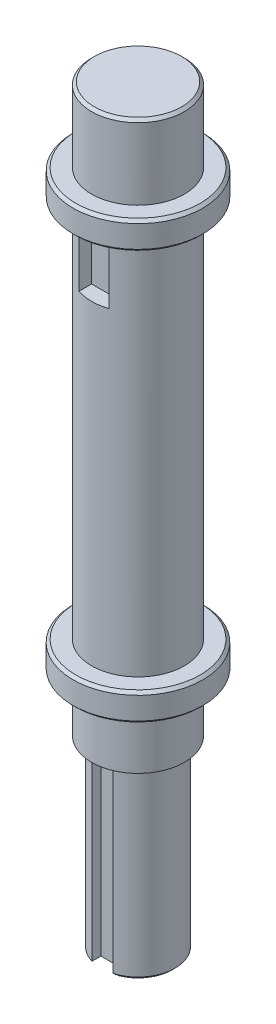
ISO-10303-21;
HEADER;
FILE_DESCRIPTION(('STEP AP214'),'2;1');
FILE_NAME('part.step','',(''),(''),'','','');
FILE_SCHEMA(('AUTOMOTIVE_DESIGN { 1 0 10303 214 1 1 1 1 }'));
ENDSEC;
DATA;
#1=APPLICATION_CONTEXT('core data for automotive mechanical design processes');
#2=APPLICATION_PROTOCOL_DEFINITION('international standard','automotive_design',2000,#1);
#3=PRODUCT_CONTEXT('',#1,'mechanical');
#4=PRODUCT('Part','Part','',(#3));
#5=PRODUCT_RELATED_PRODUCT_CATEGORY('part','',(#4));
#6=PRODUCT_DEFINITION_FORMATION('','',#4);
#7=PRODUCT_DEFINITION_CONTEXT('part definition',#1,'design');
#8=PRODUCT_DEFINITION('design','',#6,#7);
#9=PRODUCT_DEFINITION_SHAPE('','',#8);
#10=(LENGTH_UNIT() NAMED_UNIT(*) SI_UNIT(.MILLI.,.METRE.));
#11=(NAMED_UNIT(*) PLANE_ANGLE_UNIT() SI_UNIT($,.RADIAN.));
#12=(NAMED_UNIT(*) SI_UNIT($,.STERADIAN.) SOLID_ANGLE_UNIT());
#13=UNCERTAINTY_MEASURE_WITH_UNIT(LENGTH_MEASURE(1.E-05),#10,'distance_accuracy_value','');
#14=(GEOMETRIC_REPRESENTATION_CONTEXT(3) GLOBAL_UNCERTAINTY_ASSIGNED_CONTEXT((#13)) GLOBAL_UNIT_ASSIGNED_CONTEXT((#10,
#11,#12)) REPRESENTATION_CONTEXT('',''));
#15=CARTESIAN_POINT('',(0.,0.,0.));
#16=DIRECTION('',(0.,0.,1.));
#17=DIRECTION('',(1.,0.,0.));
#18=AXIS2_PLACEMENT_3D('',#15,#16,#17);
#19=CARTESIAN_POINT('',(0.,81.,0.));
#20=DIRECTION('',(0.,1.,0.));
#21=DIRECTION('',(-1.,0.,0.));
#22=AXIS2_PLACEMENT_3D('',#19,#20,#21);
#23=CYLINDRICAL_SURFACE('',#22,5.);
#24=DIRECTION('',(0.,1.,0.));
#25=VECTOR('',#24,1.);
#26=CARTESIAN_POINT('',(1.62499999999999,81.,4.72857007984444));
#27=LINE('',#26,#25);
#28=CARTESIAN_POINT('',(1.62499999999999,63.,4.72857007984444));
#29=VERTEX_POINT('',#28);
#30=CARTESIAN_POINT('',(1.62499999999999,70.,4.72857007984444));
#31=VERTEX_POINT('',#30);
#32=EDGE_CURVE('E168',#29,#31,#27,.T.);
#33=ORIENTED_EDGE('',*,*,#32,.F.);
#34=CARTESIAN_POINT('',(0.,63.,0.));
#35=DIRECTION('',(0.,-1.,0.));
#36=DIRECTION('',(0.,0.,-1.));
#37=AXIS2_PLACEMENT_3D('',#34,#35,#36);
#38=CIRCLE('',#37,5.);
#39=CARTESIAN_POINT('',(-1.625,63.,4.72857007984444));
#40=VERTEX_POINT('',#39);
#41=EDGE_CURVE('E177',#29,#40,#38,.T.);
#42=ORIENTED_EDGE('',*,*,#41,.T.);
#43=DIRECTION('',(0.,1.,0.));
#44=VECTOR('',#43,1.);
#45=CARTESIAN_POINT('',(-1.625,81.,4.72857007984444));
#46=LINE('',#45,#44);
#47=CARTESIAN_POINT('',(-1.625,70.,4.72857007984444));
#48=VERTEX_POINT('',#47);
#49=EDGE_CURVE('E166',#48,#40,#46,.F.);
#50=ORIENTED_EDGE('',*,*,#49,.F.);
#51=CARTESIAN_POINT('',(0.,70.,0.));
#52=DIRECTION('',(0.,1.,0.));
#53=DIRECTION('',(-1.,0.,0.));
#54=AXIS2_PLACEMENT_3D('',#51,#52,#53);
#55=CIRCLE('',#54,5.);
#56=EDGE_CURVE('E174',#31,#48,#55,.T.);
#57=ORIENTED_EDGE('',*,*,#56,.F.);
#58=EDGE_LOOP('',(#33,#42,#50,#57));
#59=FACE_BOUND('',#58,.T.);
#60=CARTESIAN_POINT('',(0.,29.,0.));
#61=DIRECTION('',(0.,-1.,0.));
#62=DIRECTION('',(1.,0.,0.));
#63=AXIS2_PLACEMENT_3D('',#60,#61,#62);
#64=CIRCLE('',#63,5.);
#65=CARTESIAN_POINT('',(5.,29.,0.));
#66=VERTEX_POINT('',#65);
#67=EDGE_CURVE('E214',#66,#66,#64,.T.);
#68=ORIENTED_EDGE('',*,*,#67,.F.);
#69=EDGE_LOOP('',(#68));
#70=FACE_BOUND('',#69,.T.);
#71=ADVANCED_FACE('F33',(#59,#70),#23,.T.);
#72=CARTESIAN_POINT('',(5.,70.,0.));
#73=DIRECTION('',(0.,1.,0.));
#74=DIRECTION('',(-1.,0.,0.));
#75=AXIS2_PLACEMENT_3D('',#72,#73,#74);
#76=PLANE('',#75);
#77=CARTESIAN_POINT('',(0.,70.,0.));
#78=DIRECTION('',(0.,1.,0.));
#79=DIRECTION('',(-1.,0.,0.));
#80=AXIS2_PLACEMENT_3D('',#77,#78,#79);
#81=CIRCLE('',#80,6.69999999999999);
#82=CARTESIAN_POINT('',(-6.69999999999999,70.,0.));
#83=VERTEX_POINT('',#82);
#84=EDGE_CURVE('E208',#83,#83,#81,.F.);
#85=ORIENTED_EDGE('',*,*,#84,.T.);
#86=EDGE_LOOP('',(#85));
#87=FACE_BOUND('',#86,.T.);
#88=ORIENTED_EDGE('',*,*,#56,.T.);
#89=DIRECTION('',(0.,0.,-1.));
#90=VECTOR('',#89,1.);
#91=CARTESIAN_POINT('',(-1.62500000000001,70.,6.625));
#92=LINE('',#91,#90);
#93=CARTESIAN_POINT('',(-1.625,70.,3.375));
#94=VERTEX_POINT('',#93);
#95=EDGE_CURVE('E158',#48,#94,#92,.T.);
#96=ORIENTED_EDGE('',*,*,#95,.T.);
#97=DIRECTION('',(1.,0.,0.));
#98=VECTOR('',#97,1.);
#99=CARTESIAN_POINT('',(-1.625,70.,3.375));
#100=LINE('',#99,#98);
#101=CARTESIAN_POINT('',(1.625,70.,3.375));
#102=VERTEX_POINT('',#101);
#103=EDGE_CURVE('E151',#94,#102,#100,.T.);
#104=ORIENTED_EDGE('',*,*,#103,.T.);
#105=DIRECTION('',(0.,0.,1.));
#106=VECTOR('',#105,1.);
#107=CARTESIAN_POINT('',(1.62499999999999,70.,6.625));
#108=LINE('',#107,#106);
#109=EDGE_CURVE('E156',#102,#31,#108,.T.);
#110=ORIENTED_EDGE('',*,*,#109,.T.);
#111=EDGE_LOOP('',(#88,#96,#104,#110));
#112=FACE_BOUND('',#111,.T.);
#113=ADVANCED_FACE('F293',(#87,#112),#76,.F.);
#114=CARTESIAN_POINT('',(0.,81.,0.));
#115=DIRECTION('',(0.,1.,0.));
#116=DIRECTION('',(-1.,0.,0.));
#117=AXIS2_PLACEMENT_3D('',#114,#115,#116);
#118=CYLINDRICAL_SURFACE('',#117,7.00000000000001);
#119=CARTESIAN_POINT('',(0.,70.3,0.));
#120=DIRECTION('',(0.,1.,0.));
#121=DIRECTION('',(-1.,0.,0.));
#122=AXIS2_PLACEMENT_3D('',#119,#120,#121);
#123=CIRCLE('',#122,7.00000000000001);
#124=CARTESIAN_POINT('',(-7.00000000000001,70.3,0.));
#125=VERTEX_POINT('',#124);
#126=EDGE_CURVE('E205',#125,#125,#123,.T.);
#127=ORIENTED_EDGE('',*,*,#126,.T.);
#128=EDGE_LOOP('',(#127));
#129=FACE_BOUND('',#128,.T.);
#130=CARTESIAN_POINT('',(0.,72.7,0.));
#131=DIRECTION('',(0.,-1.,0.));
#132=DIRECTION('',(1.,0.,0.));
#133=AXIS2_PLACEMENT_3D('',#130,#131,#132);
#134=CIRCLE('',#133,7.00000000000001);
#135=CARTESIAN_POINT('',(7.,72.7,0.));
#136=VERTEX_POINT('',#135);
#137=EDGE_CURVE('E202',#136,#136,#134,.T.);
#138=ORIENTED_EDGE('',*,*,#137,.T.);
#139=EDGE_LOOP('',(#138));
#140=FACE_BOUND('',#139,.T.);
#141=ADVANCED_FACE('F298',(#129,#140),#118,.T.);
#142=CARTESIAN_POINT('',(7.,73.,0.));
#143=DIRECTION('',(0.,-1.,0.));
#144=DIRECTION('',(1.,0.,0.));
#145=AXIS2_PLACEMENT_3D('',#142,#143,#144);
#146=PLANE('',#145);
#147=CARTESIAN_POINT('',(0.,73.,0.));
#148=DIRECTION('',(0.,-1.,0.));
#149=DIRECTION('',(1.,0.,0.));
#150=AXIS2_PLACEMENT_3D('',#147,#148,#149);
#151=CIRCLE('',#150,6.7);
#152=CARTESIAN_POINT('',(6.69999999999999,73.,0.));
#153=VERTEX_POINT('',#152);
#154=EDGE_CURVE('E211',#153,#153,#151,.F.);
#155=ORIENTED_EDGE('',*,*,#154,.T.);
#156=EDGE_LOOP('',(#155));
#157=FACE_BOUND('',#156,.T.);
#158=CARTESIAN_POINT('',(0.,73.,0.));
#159=DIRECTION('',(0.,1.,0.));
#160=DIRECTION('',(-1.,0.,0.));
#161=AXIS2_PLACEMENT_3D('',#158,#159,#160);
#162=CIRCLE('',#161,5.);
#163=CARTESIAN_POINT('',(-5.00000000000001,73.,0.));
#164=VERTEX_POINT('',#163);
#165=EDGE_CURVE('E171',#164,#164,#162,.T.);
#166=ORIENTED_EDGE('',*,*,#165,.F.);
#167=EDGE_LOOP('',(#166));
#168=FACE_BOUND('',#167,.T.);
#169=ADVANCED_FACE('F354',(#157,#168),#146,.F.);
#170=CARTESIAN_POINT('',(0.,81.,0.));
#171=DIRECTION('',(0.,1.,0.));
#172=DIRECTION('',(-1.,0.,0.));
#173=AXIS2_PLACEMENT_3D('',#170,#171,#172);
#174=CYLINDRICAL_SURFACE('',#173,5.);
#175=CARTESIAN_POINT('',(0.,80.7,0.));
#176=DIRECTION('',(0.,-1.,0.));
#177=DIRECTION('',(1.,0.,0.));
#178=AXIS2_PLACEMENT_3D('',#175,#176,#177);
#179=CIRCLE('',#178,5.);
#180=CARTESIAN_POINT('',(5.,80.7,0.));
#181=VERTEX_POINT('',#180);
#182=EDGE_CURVE('E199',#181,#181,#179,.T.);
#183=ORIENTED_EDGE('',*,*,#182,.T.);
#184=EDGE_LOOP('',(#183));
#185=FACE_BOUND('',#184,.T.);
#186=ORIENTED_EDGE('',*,*,#165,.T.);
#187=EDGE_LOOP('',(#186));
#188=FACE_BOUND('',#187,.T.);
#189=ADVANCED_FACE('F350',(#185,#188),#174,.T.);
#190=CARTESIAN_POINT('',(5.,81.,0.));
#191=DIRECTION('',(0.,-1.,0.));
#192=DIRECTION('',(1.,0.,0.));
#193=AXIS2_PLACEMENT_3D('',#190,#191,#192);
#194=PLANE('',#193);
#195=CARTESIAN_POINT('',(0.,81.,0.));
#196=DIRECTION('',(0.,-1.,0.));
#197=DIRECTION('',(1.,0.,0.));
#198=AXIS2_PLACEMENT_3D('',#195,#196,#197);
#199=CIRCLE('',#198,4.7);
#200=CARTESIAN_POINT('',(4.69999999999999,81.,0.));
#201=VERTEX_POINT('',#200);
#202=EDGE_CURVE('E196',#201,#201,#199,.F.);
#203=ORIENTED_EDGE('',*,*,#202,.T.);
#204=EDGE_LOOP('',(#203));
#205=FACE_BOUND('',#204,.T.);
#206=ADVANCED_FACE('F335',(#205),#194,.F.);
#207=CARTESIAN_POINT('',(0.,63.,0.));
#208=DIRECTION('',(0.,-1.,0.));
#209=DIRECTION('',(0.,0.,-1.));
#210=AXIS2_PLACEMENT_3D('',#207,#208,#209);
#211=PLANE('',#210);
#212=DIRECTION('',(0.,0.,1.));
#213=VECTOR('',#212,1.);
#214=CARTESIAN_POINT('',(1.62499999999999,63.,6.625));
#215=LINE('',#214,#213);
#216=CARTESIAN_POINT('',(1.625,63.,3.375));
#217=VERTEX_POINT('',#216);
#218=EDGE_CURVE('E147',#217,#29,#215,.T.);
#219=ORIENTED_EDGE('',*,*,#218,.F.);
#220=DIRECTION('',(1.,0.,0.));
#221=VECTOR('',#220,1.);
#222=CARTESIAN_POINT('',(-1.625,63.,3.375));
#223=LINE('',#222,#221);
#224=CARTESIAN_POINT('',(-1.625,63.,3.375));
#225=VERTEX_POINT('',#224);
#226=EDGE_CURVE('E153',#225,#217,#223,.T.);
#227=ORIENTED_EDGE('',*,*,#226,.F.);
#228=DIRECTION('',(0.,0.,-1.));
#229=VECTOR('',#228,1.);
#230=CARTESIAN_POINT('',(-1.62500000000001,63.,6.625));
#231=LINE('',#230,#229);
#232=EDGE_CURVE('E150',#40,#225,#231,.T.);
#233=ORIENTED_EDGE('',*,*,#232,.F.);
#234=ORIENTED_EDGE('',*,*,#41,.F.);
#235=EDGE_LOOP('',(#219,#227,#233,#234));
#236=FACE_BOUND('',#235,.T.);
#237=ADVANCED_FACE('F331',(#236),#211,.F.);
#238=CARTESIAN_POINT('',(1.62499999999999,63.,6.625));
#239=DIRECTION('',(-1.,0.,0.));
#240=DIRECTION('',(0.,0.,1.));
#241=AXIS2_PLACEMENT_3D('',#238,#239,#240);
#242=PLANE('',#241);
#243=ORIENTED_EDGE('',*,*,#32,.T.);
#244=ORIENTED_EDGE('',*,*,#109,.F.);
#245=DIRECTION('',(0.,1.,0.));
#246=VECTOR('',#245,1.);
#247=CARTESIAN_POINT('',(1.625,63.,3.375));
#248=LINE('',#247,#246);
#249=EDGE_CURVE('E155',#217,#102,#248,.T.);
#250=ORIENTED_EDGE('',*,*,#249,.F.);
#251=ORIENTED_EDGE('',*,*,#218,.T.);
#252=EDGE_LOOP('',(#243,#244,#250,#251));
#253=FACE_BOUND('',#252,.T.);
#254=ADVANCED_FACE('F334',(#253),#242,.T.);
#255=CARTESIAN_POINT('',(-1.62500000000001,63.,6.625));
#256=DIRECTION('',(1.,0.,0.));
#257=DIRECTION('',(0.,0.,-1.));
#258=AXIS2_PLACEMENT_3D('',#255,#256,#257);
#259=PLANE('',#258);
#260=ORIENTED_EDGE('',*,*,#49,.T.);
#261=ORIENTED_EDGE('',*,*,#232,.T.);
#262=DIRECTION('',(0.,1.,0.));
#263=VECTOR('',#262,1.);
#264=CARTESIAN_POINT('',(-1.625,63.,3.375));
#265=LINE('',#264,#263);
#266=EDGE_CURVE('E163',#225,#94,#265,.T.);
#267=ORIENTED_EDGE('',*,*,#266,.T.);
#268=ORIENTED_EDGE('',*,*,#95,.F.);
#269=EDGE_LOOP('',(#260,#261,#267,#268));
#270=FACE_BOUND('',#269,.T.);
#271=ADVANCED_FACE('F340',(#270),#259,.T.);
#272=CARTESIAN_POINT('',(-1.625,63.,3.375));
#273=DIRECTION('',(0.,0.,1.));
#274=DIRECTION('',(1.,0.,0.));
#275=AXIS2_PLACEMENT_3D('',#272,#273,#274);
#276=PLANE('',#275);
#277=ORIENTED_EDGE('',*,*,#103,.F.);
#278=ORIENTED_EDGE('',*,*,#266,.F.);
#279=ORIENTED_EDGE('',*,*,#226,.T.);
#280=ORIENTED_EDGE('',*,*,#249,.T.);
#281=EDGE_LOOP('',(#277,#278,#279,#280));
#282=FACE_BOUND('',#281,.T.);
#283=ADVANCED_FACE('F337',(#282),#276,.T.);
#284=CARTESIAN_POINT('',(0.,81.,0.));
#285=DIRECTION('',(0.,-1.,0.));
#286=DIRECTION('',(1.,0.,0.));
#287=AXIS2_PLACEMENT_3D('',#284,#285,#286);
#288=CONICAL_SURFACE('',#287,4.7,0.785398163397448);
#289=ORIENTED_EDGE('',*,*,#182,.F.);
#290=EDGE_LOOP('',(#289));
#291=FACE_BOUND('',#290,.T.);
#292=ORIENTED_EDGE('',*,*,#202,.F.);
#293=EDGE_LOOP('',(#292));
#294=FACE_BOUND('',#293,.T.);
#295=ADVANCED_FACE('F245',(#291,#294),#288,.T.);
#296=CARTESIAN_POINT('',(0.,70.3,0.));
#297=DIRECTION('',(0.,1.,0.));
#298=DIRECTION('',(-1.,0.,0.));
#299=AXIS2_PLACEMENT_3D('',#296,#297,#298);
#300=CONICAL_SURFACE('',#299,7.00000000000001,0.785398163397437);
#301=ORIENTED_EDGE('',*,*,#84,.F.);
#302=EDGE_LOOP('',(#301));
#303=FACE_BOUND('',#302,.T.);
#304=ORIENTED_EDGE('',*,*,#126,.F.);
#305=EDGE_LOOP('',(#304));
#306=FACE_BOUND('',#305,.T.);
#307=ADVANCED_FACE('F369',(#303,#306),#300,.T.);
#308=CARTESIAN_POINT('',(0.,73.,0.));
#309=DIRECTION('',(0.,-1.,0.));
#310=DIRECTION('',(1.,0.,0.));
#311=AXIS2_PLACEMENT_3D('',#308,#309,#310);
#312=CONICAL_SURFACE('',#311,6.7,0.785398163397495);
#313=ORIENTED_EDGE('',*,*,#137,.F.);
#314=EDGE_LOOP('',(#313));
#315=FACE_BOUND('',#314,.T.);
#316=ORIENTED_EDGE('',*,*,#154,.F.);
#317=EDGE_LOOP('',(#316));
#318=FACE_BOUND('',#317,.T.);
#319=ADVANCED_FACE('F366',(#315,#318),#312,.T.);
#320=CARTESIAN_POINT('',(0.,29.,0.));
#321=DIRECTION('',(0.,-1.,0.));
#322=DIRECTION('',(1.,0.,0.));
#323=AXIS2_PLACEMENT_3D('',#320,#321,#322);
#324=CYLINDRICAL_SURFACE('',#323,7.00000000000001);
#325=CARTESIAN_POINT('',(0.,26.3,0.));
#326=DIRECTION('',(0.,-1.,0.));
#327=DIRECTION('',(1.,0.,0.));
#328=AXIS2_PLACEMENT_3D('',#325,#326,#327);
#329=CIRCLE('',#328,7.00000000000001);
#330=CARTESIAN_POINT('',(7.,26.3,0.));
#331=VERTEX_POINT('',#330);
#332=EDGE_CURVE('E41',#331,#331,#329,.F.);
#333=ORIENTED_EDGE('',*,*,#332,.T.);
#334=EDGE_LOOP('',(#333));
#335=FACE_BOUND('',#334,.T.);
#336=CARTESIAN_POINT('',(0.,28.7,0.));
#337=DIRECTION('',(0.,-1.,0.));
#338=DIRECTION('',(1.,0.,0.));
#339=AXIS2_PLACEMENT_3D('',#336,#337,#338);
#340=CIRCLE('',#339,7.00000000000001);
#341=CARTESIAN_POINT('',(7.,28.7,0.));
#342=VERTEX_POINT('',#341);
#343=EDGE_CURVE('E259',#342,#342,#340,.T.);
#344=ORIENTED_EDGE('',*,*,#343,.T.);
#345=EDGE_LOOP('',(#344));
#346=FACE_BOUND('',#345,.T.);
#347=ADVANCED_FACE('F264',(#335,#346),#324,.T.);
#348=CARTESIAN_POINT('',(0.,29.,0.));
#349=DIRECTION('',(0.,-1.,0.));
#350=DIRECTION('',(1.,0.,0.));
#351=AXIS2_PLACEMENT_3D('',#348,#349,#350);
#352=PLANE('',#351);
#353=CARTESIAN_POINT('',(0.,29.,0.));
#354=DIRECTION('',(0.,-1.,0.));
#355=DIRECTION('',(1.,0.,0.));
#356=AXIS2_PLACEMENT_3D('',#353,#354,#355);
#357=CIRCLE('',#356,6.70000000000001);
#358=CARTESIAN_POINT('',(6.70000000000001,29.,0.));
#359=VERTEX_POINT('',#358);
#360=EDGE_CURVE('E11',#359,#359,#357,.F.);
#361=ORIENTED_EDGE('',*,*,#360,.T.);
#362=EDGE_LOOP('',(#361));
#363=FACE_BOUND('',#362,.T.);
#364=ORIENTED_EDGE('',*,*,#67,.T.);
#365=EDGE_LOOP('',(#364));
#366=FACE_BOUND('',#365,.T.);
#367=ADVANCED_FACE('F276',(#363,#366),#352,.F.);
#368=CARTESIAN_POINT('',(0.,26.,0.));
#369=DIRECTION('',(0.,-1.,0.));
#370=DIRECTION('',(1.,0.,0.));
#371=AXIS2_PLACEMENT_3D('',#368,#369,#370);
#372=PLANE('',#371);
#373=CARTESIAN_POINT('',(0.,26.,0.));
#374=DIRECTION('',(0.,-1.,0.));
#375=DIRECTION('',(1.,0.,0.));
#376=AXIS2_PLACEMENT_3D('',#373,#374,#375);
#377=CIRCLE('',#376,6.70000000000001);
#378=CARTESIAN_POINT('',(6.70000000000001,26.,0.));
#379=VERTEX_POINT('',#378);
#380=EDGE_CURVE('E256',#379,#379,#377,.T.);
#381=ORIENTED_EDGE('',*,*,#380,.T.);
#382=EDGE_LOOP('',(#381));
#383=FACE_BOUND('',#382,.T.);
#384=CARTESIAN_POINT('',(0.,26.,0.));
#385=DIRECTION('',(0.,-1.,0.));
#386=DIRECTION('',(1.,0.,0.));
#387=AXIS2_PLACEMENT_3D('',#384,#385,#386);
#388=CIRCLE('',#387,5.);
#389=CARTESIAN_POINT('',(5.,26.,0.));
#390=VERTEX_POINT('',#389);
#391=EDGE_CURVE('E218',#390,#390,#388,.T.);
#392=ORIENTED_EDGE('',*,*,#391,.F.);
#393=EDGE_LOOP('',(#392));
#394=FACE_BOUND('',#393,.T.);
#395=ADVANCED_FACE('F273',(#383,#394),#372,.T.);
#396=CARTESIAN_POINT('',(0.,0.,0.));
#397=DIRECTION('',(0.,1.,0.));
#398=DIRECTION('',(-1.,0.,0.));
#399=AXIS2_PLACEMENT_3D('',#396,#397,#398);
#400=PLANE('',#399);
#401=DIRECTION('',(-1.,0.,0.));
#402=VECTOR('',#401,1.);
#403=CARTESIAN_POINT('',(0.,0.,2.57500000000001));
#404=LINE('',#403,#402);
#405=CARTESIAN_POINT('',(1.42499999999999,0.,2.57500000000001));
#406=VERTEX_POINT('',#405);
#407=CARTESIAN_POINT('',(-1.42499999999999,0.,2.57500000000001));
#408=VERTEX_POINT('',#407);
#409=EDGE_CURVE('E188',#406,#408,#404,.T.);
#410=ORIENTED_EDGE('',*,*,#409,.T.);
#411=DIRECTION('',(0.,0.,1.));
#412=VECTOR('',#411,1.);
#413=CARTESIAN_POINT('',(-1.42499999999999,0.,0.));
#414=LINE('',#413,#412);
#415=CARTESIAN_POINT('',(-1.42499999999999,0.,3.41458269778315));
#416=VERTEX_POINT('',#415);
#417=EDGE_CURVE('E190',#408,#416,#414,.T.);
#418=ORIENTED_EDGE('',*,*,#417,.T.);
#419=CARTESIAN_POINT('',(0.,0.,0.));
#420=DIRECTION('',(0.,1.,0.));
#421=DIRECTION('',(-1.,0.,0.));
#422=AXIS2_PLACEMENT_3D('',#419,#420,#421);
#423=CIRCLE('',#422,3.70000000000001);
#424=CARTESIAN_POINT('',(1.42499999999999,0.,3.41458269778315));
#425=VERTEX_POINT('',#424);
#426=EDGE_CURVE('E184',#416,#425,#423,.F.);
#427=ORIENTED_EDGE('',*,*,#426,.T.);
#428=DIRECTION('',(0.,0.,-1.));
#429=VECTOR('',#428,1.);
#430=CARTESIAN_POINT('',(1.42499999999999,0.,2.875));
#431=LINE('',#430,#429);
#432=EDGE_CURVE('E186',#425,#406,#431,.T.);
#433=ORIENTED_EDGE('',*,*,#432,.T.);
#434=EDGE_LOOP('',(#410,#418,#427,#433));
#435=FACE_BOUND('',#434,.T.);
#436=ADVANCED_FACE('F243',(#435),#400,.F.);
#437=CARTESIAN_POINT('',(1.42499999999999,0.,0.));
#438=DIRECTION('',(-0.707106781186539,-0.707106781186556,0.));
#439=DIRECTION('',(0.,0.,1.));
#440=AXIS2_PLACEMENT_3D('',#437,#438,#439);
#441=PLANE('',#440);
#442=DIRECTION('',(-0.57735026918963,0.577350269189617,0.57735026918963));
#443=VECTOR('',#442,1.);
#444=CARTESIAN_POINT('',(0.749999999999994,0.674999999999982,3.25000000000001));
#445=LINE('',#444,#443);
#446=CARTESIAN_POINT('',(1.125,0.299999999999984,2.875));
#447=VERTEX_POINT('',#446);
#448=EDGE_CURVE('E225',#406,#447,#445,.T.);
#449=ORIENTED_EDGE('',*,*,#448,.F.);
#450=ORIENTED_EDGE('',*,*,#432,.F.);
#451=CARTESIAN_POINT('',(1.125,0.299999999999984,3.83853813319602));
#452=CARTESIAN_POINT('',(1.1507048607708,0.274295139229186,3.80421808409508));
#453=CARTESIAN_POINT('',(1.17624773767772,0.248752262322264,3.76965475978186));
#454=CARTESIAN_POINT('',(1.22698392786877,0.198016072131217,3.70003404609249));
#455=CARTESIAN_POINT('',(1.25217731459507,0.172822685404918,3.66497676373659));
#456=CARTESIAN_POINT('',(1.30220045137013,0.122799548629863,3.5943452292401));
#457=CARTESIAN_POINT('',(1.32703019365086,0.0979698063491303,3.55877096608822));
#458=CARTESIAN_POINT('',(1.3763082429148,0.0486917570851878,3.48708327953836));
#459=CARTESIAN_POINT('',(1.40075646733498,0.0242435326650145,3.45096974265816));
#460=CARTESIAN_POINT('',(1.42499999999999,0.,3.41458269778316));
#461=B_SPLINE_CURVE_WITH_KNOTS('',3,(#451,#452,#453,#454,#455,#456,#457,#458,#459,#460),
.UNSPECIFIED.,.F.,.F.,(4,2,2,2,4),(0.,0.149979870533063,0.299927731594465,0.449878791122303,
0.599861863214308),.UNSPECIFIED.);
#462=CARTESIAN_POINT('',(1.125,0.299999999999984,3.83853813319602));
#463=VERTEX_POINT('',#462);
#464=EDGE_CURVE('E132',#463,#425,#461,.T.);
#465=ORIENTED_EDGE('',*,*,#464,.F.);
#466=DIRECTION('',(0.,0.,1.));
#467=VECTOR('',#466,1.);
#468=CARTESIAN_POINT('',(1.125,0.299999999999984,3.83853813319602));
#469=LINE('',#468,#467);
#470=EDGE_CURVE('E48',#447,#463,#469,.T.);
#471=ORIENTED_EDGE('',*,*,#470,.F.);
#472=EDGE_LOOP('',(#449,#450,#465,#471));
#473=FACE_BOUND('',#472,.T.);
#474=ADVANCED_FACE('F238',(#473),#441,.T.);
#475=CARTESIAN_POINT('',(0.,0.299999999999984,2.875));
#476=DIRECTION('',(0.,0.707106781186556,-0.70710678118654));
#477=DIRECTION('',(1.,0.,0.));
#478=AXIS2_PLACEMENT_3D('',#475,#476,#477);
#479=PLANE('',#478);
#480=ORIENTED_EDGE('',*,*,#448,.T.);
#481=DIRECTION('',(1.,0.,0.));
#482=VECTOR('',#481,1.);
#483=CARTESIAN_POINT('',(0.,0.299999999999984,2.875));
#484=LINE('',#483,#482);
#485=CARTESIAN_POINT('',(-1.125,0.299999999999984,2.875));
#486=VERTEX_POINT('',#485);
#487=EDGE_CURVE('E56',#486,#447,#484,.T.);
#488=ORIENTED_EDGE('',*,*,#487,.F.);
#489=DIRECTION('',(-0.57735026918963,-0.577350269189617,-0.57735026918963));
#490=VECTOR('',#489,1.);
#491=CARTESIAN_POINT('',(-2.08333333333335,-0.658333333333342,1.91666666666665));
#492=LINE('',#491,#490);
#493=EDGE_CURVE('E215',#408,#486,#492,.F.);
#494=ORIENTED_EDGE('',*,*,#493,.F.);
#495=ORIENTED_EDGE('',*,*,#409,.F.);
#496=EDGE_LOOP('',(#480,#488,#494,#495));
#497=FACE_BOUND('',#496,.T.);
#498=ADVANCED_FACE('F234',(#497),#479,.F.);
#499=CARTESIAN_POINT('',(-1.125,0.299999999999984,0.));
#500=DIRECTION('',(-0.70710678118654,0.707106781186555,0.));
#501=DIRECTION('',(0.,0.,-1.));
#502=AXIS2_PLACEMENT_3D('',#499,#500,#501);
#503=PLANE('',#502);
#504=CARTESIAN_POINT('',(-1.42499999999999,0.,3.41458269778315));
#505=CARTESIAN_POINT('',(-1.40075646733497,0.0242435326650155,3.45096974265816));
#506=CARTESIAN_POINT('',(-1.3763082429148,0.048691757085188,3.48708327953835));
#507=CARTESIAN_POINT('',(-1.32703019365086,0.0979698063491292,3.55877096608822));
#508=CARTESIAN_POINT('',(-1.30220045137013,0.122799548629861,3.5943452292401));
#509=CARTESIAN_POINT('',(-1.25217731459507,0.172822685404918,3.66497676373659));
#510=CARTESIAN_POINT('',(-1.22698392786877,0.198016072131219,3.70003404609248));
#511=CARTESIAN_POINT('',(-1.17624773767773,0.24875226232226,3.76965475978186));
#512=CARTESIAN_POINT('',(-1.15070486077081,0.274295139229172,3.80421808409509));
#513=CARTESIAN_POINT('',(-1.12500000000003,0.29999999999995,3.83853813319607));
#514=B_SPLINE_CURVE_WITH_KNOTS('',3,(#504,#505,#506,#507,#508,#509,#510,#511,#512,#513),
.UNSPECIFIED.,.F.,.F.,(4,2,2,2,4),(0.,0.149983072092004,0.299934131619842,0.449881992681243,
0.599861863214305),.UNSPECIFIED.);
#515=CARTESIAN_POINT('',(-1.125,0.299999999999984,3.83853813319602));
#516=VERTEX_POINT('',#515);
#517=EDGE_CURVE('E217',#516,#416,#514,.F.);
#518=ORIENTED_EDGE('',*,*,#517,.T.);
#519=ORIENTED_EDGE('',*,*,#417,.F.);
#520=ORIENTED_EDGE('',*,*,#493,.T.);
#521=DIRECTION('',(0.,0.,-1.));
#522=VECTOR('',#521,1.);
#523=CARTESIAN_POINT('',(-1.125,0.299999999999984,0.));
#524=LINE('',#523,#522);
#525=EDGE_CURVE('E180',#516,#486,#524,.T.);
#526=ORIENTED_EDGE('',*,*,#525,.F.);
#527=EDGE_LOOP('',(#518,#519,#520,#526));
#528=FACE_BOUND('',#527,.T.);
#529=ADVANCED_FACE('F230',(#528),#503,.F.);
#530=CARTESIAN_POINT('',(0.,0.,0.));
#531=DIRECTION('',(0.,1.,0.));
#532=DIRECTION('',(-1.,0.,0.));
#533=AXIS2_PLACEMENT_3D('',#530,#531,#532);
#534=CONICAL_SURFACE('',#533,3.70000000000001,0.78539816339746);
#535=ORIENTED_EDGE('',*,*,#464,.T.);
#536=ORIENTED_EDGE('',*,*,#426,.F.);
#537=ORIENTED_EDGE('',*,*,#517,.F.);
#538=CARTESIAN_POINT('',(0.,0.299999999999984,0.));
#539=DIRECTION('',(0.,1.,0.));
#540=DIRECTION('',(-1.,0.,0.));
#541=AXIS2_PLACEMENT_3D('',#538,#539,#540);
#542=CIRCLE('',#541,4.);
#543=EDGE_CURVE('E118',#463,#516,#542,.T.);
#544=ORIENTED_EDGE('',*,*,#543,.F.);
#545=EDGE_LOOP('',(#535,#536,#537,#544));
#546=FACE_BOUND('',#545,.T.);
#547=ADVANCED_FACE('F227',(#546),#534,.T.);
#548=CARTESIAN_POINT('',(1.125,20.,0.));
#549=DIRECTION('',(-1.,0.,0.));
#550=DIRECTION('',(0.,0.,1.));
#551=AXIS2_PLACEMENT_3D('',#548,#549,#550);
#552=PLANE('',#551);
#553=DIRECTION('',(0.,-1.,0.));
#554=VECTOR('',#553,1.);
#555=CARTESIAN_POINT('',(1.125,20.,2.875));
#556=LINE('',#555,#554);
#557=CARTESIAN_POINT('',(1.125,20.,2.875));
#558=VERTEX_POINT('',#557);
#559=EDGE_CURVE('E144',#558,#447,#556,.T.);
#560=ORIENTED_EDGE('',*,*,#559,.T.);
#561=ORIENTED_EDGE('',*,*,#470,.T.);
#562=DIRECTION('',(0.,-1.,0.));
#563=VECTOR('',#562,1.);
#564=CARTESIAN_POINT('',(1.125,20.,3.83853813319602));
#565=LINE('',#564,#563);
#566=CARTESIAN_POINT('',(1.125,20.,3.83853813319602));
#567=VERTEX_POINT('',#566);
#568=EDGE_CURVE('E141',#567,#463,#565,.T.);
#569=ORIENTED_EDGE('',*,*,#568,.F.);
#570=DIRECTION('',(0.,0.,-1.));
#571=VECTOR('',#570,1.);
#572=CARTESIAN_POINT('',(1.125,20.,0.));
#573=LINE('',#572,#571);
#574=EDGE_CURVE('E124',#567,#558,#573,.T.);
#575=ORIENTED_EDGE('',*,*,#574,.T.);
#576=EDGE_LOOP('',(#560,#561,#569,#575));
#577=FACE_BOUND('',#576,.T.);
#578=ADVANCED_FACE('F317',(#577),#552,.T.);
#579=CARTESIAN_POINT('',(0.,20.,2.875));
#580=DIRECTION('',(0.,0.,-1.));
#581=DIRECTION('',(-1.,0.,0.));
#582=AXIS2_PLACEMENT_3D('',#579,#580,#581);
#583=PLANE('',#582);
#584=DIRECTION('',(0.,-1.,0.));
#585=VECTOR('',#584,1.);
#586=CARTESIAN_POINT('',(-1.125,20.,2.875));
#587=LINE('',#586,#585);
#588=CARTESIAN_POINT('',(-1.125,20.,2.875));
#589=VERTEX_POINT('',#588);
#590=EDGE_CURVE('E123',#589,#486,#587,.T.);
#591=ORIENTED_EDGE('',*,*,#590,.T.);
#592=ORIENTED_EDGE('',*,*,#487,.T.);
#593=ORIENTED_EDGE('',*,*,#559,.F.);
#594=DIRECTION('',(1.,0.,0.));
#595=VECTOR('',#594,1.);
#596=CARTESIAN_POINT('',(0.,20.,2.875));
#597=LINE('',#596,#595);
#598=EDGE_CURVE('E136',#589,#558,#597,.T.);
#599=ORIENTED_EDGE('',*,*,#598,.F.);
#600=EDGE_LOOP('',(#591,#592,#593,#599));
#601=FACE_BOUND('',#600,.T.);
#602=ADVANCED_FACE('F316',(#601),#583,.F.);
#603=CARTESIAN_POINT('',(-1.125,20.,0.));
#604=DIRECTION('',(-1.,0.,0.));
#605=DIRECTION('',(0.,0.,1.));
#606=AXIS2_PLACEMENT_3D('',#603,#604,#605);
#607=PLANE('',#606);
#608=DIRECTION('',(0.,-1.,0.));
#609=VECTOR('',#608,1.);
#610=CARTESIAN_POINT('',(-1.125,20.,3.83853813319602));
#611=LINE('',#610,#609);
#612=CARTESIAN_POINT('',(-1.125,20.,3.83853813319602));
#613=VERTEX_POINT('',#612);
#614=EDGE_CURVE('E113',#613,#516,#611,.T.);
#615=ORIENTED_EDGE('',*,*,#614,.T.);
#616=ORIENTED_EDGE('',*,*,#525,.T.);
#617=ORIENTED_EDGE('',*,*,#590,.F.);
#618=DIRECTION('',(0.,0.,-1.));
#619=VECTOR('',#618,1.);
#620=CARTESIAN_POINT('',(-1.125,20.,0.));
#621=LINE('',#620,#619);
#622=EDGE_CURVE('E131',#613,#589,#621,.T.);
#623=ORIENTED_EDGE('',*,*,#622,.F.);
#624=EDGE_LOOP('',(#615,#616,#617,#623));
#625=FACE_BOUND('',#624,.T.);
#626=ADVANCED_FACE('F134',(#625),#607,.F.);
#627=CARTESIAN_POINT('',(0.,20.,0.));
#628=DIRECTION('',(0.,-1.,0.));
#629=DIRECTION('',(1.,0.,0.));
#630=AXIS2_PLACEMENT_3D('',#627,#628,#629);
#631=CYLINDRICAL_SURFACE('',#630,4.);
#632=ORIENTED_EDGE('',*,*,#568,.T.);
#633=ORIENTED_EDGE('',*,*,#543,.T.);
#634=ORIENTED_EDGE('',*,*,#614,.F.);
#635=CARTESIAN_POINT('',(0.,20.,0.));
#636=DIRECTION('',(0.,-1.,0.));
#637=DIRECTION('',(1.,0.,0.));
#638=AXIS2_PLACEMENT_3D('',#635,#636,#637);
#639=CIRCLE('',#638,4.);
#640=EDGE_CURVE('E116',#613,#567,#639,.T.);
#641=ORIENTED_EDGE('',*,*,#640,.T.);
#642=EDGE_LOOP('',(#632,#633,#634,#641));
#643=FACE_BOUND('',#642,.T.);
#644=ADVANCED_FACE('F115',(#643),#631,.T.);
#645=CARTESIAN_POINT('',(0.,20.,0.));
#646=DIRECTION('',(0.,-1.,0.));
#647=DIRECTION('',(1.,0.,0.));
#648=AXIS2_PLACEMENT_3D('',#645,#646,#647);
#649=PLANE('',#648);
#650=ORIENTED_EDGE('',*,*,#640,.F.);
#651=ORIENTED_EDGE('',*,*,#622,.T.);
#652=ORIENTED_EDGE('',*,*,#598,.T.);
#653=ORIENTED_EDGE('',*,*,#574,.F.);
#654=EDGE_LOOP('',(#650,#651,#652,#653));
#655=FACE_BOUND('',#654,.T.);
#656=CARTESIAN_POINT('',(0.,20.,0.));
#657=DIRECTION('',(0.,-1.,0.));
#658=DIRECTION('',(1.,0.,0.));
#659=AXIS2_PLACEMENT_3D('',#656,#657,#658);
#660=CIRCLE('',#659,5.);
#661=CARTESIAN_POINT('',(5.,20.,0.));
#662=VERTEX_POINT('',#661);
#663=EDGE_CURVE('E143',#662,#662,#660,.T.);
#664=ORIENTED_EDGE('',*,*,#663,.T.);
#665=EDGE_LOOP('',(#664));
#666=FACE_BOUND('',#665,.T.);
#667=ADVANCED_FACE('F128',(#655,#666),#649,.T.);
#668=ORIENTED_EDGE('',*,*,#391,.T.);
#669=EDGE_LOOP('',(#668));
#670=FACE_BOUND('',#669,.T.);
#671=ORIENTED_EDGE('',*,*,#663,.F.);
#672=EDGE_LOOP('',(#671));
#673=FACE_BOUND('',#672,.T.);
#674=ADVANCED_FACE('F270',(#670,#673),#23,.T.);
#675=CARTESIAN_POINT('',(0.,26.,0.));
#676=DIRECTION('',(0.,1.,0.));
#677=DIRECTION('',(-1.,0.,0.));
#678=AXIS2_PLACEMENT_3D('',#675,#676,#677);
#679=CONICAL_SURFACE('',#678,6.70000000000001,0.785398163397443);
#680=ORIENTED_EDGE('',*,*,#332,.F.);
#681=EDGE_LOOP('',(#680));
#682=FACE_BOUND('',#681,.T.);
#683=ORIENTED_EDGE('',*,*,#380,.F.);
#684=EDGE_LOOP('',(#683));
#685=FACE_BOUND('',#684,.T.);
#686=ADVANCED_FACE('F267',(#682,#685),#679,.T.);
#687=CARTESIAN_POINT('',(0.,28.7,0.));
#688=DIRECTION('',(0.,-1.,0.));
#689=DIRECTION('',(1.,0.,0.));
#690=AXIS2_PLACEMENT_3D('',#687,#688,#689);
#691=CONICAL_SURFACE('',#690,7.00000000000001,0.785398163397443);
#692=ORIENTED_EDGE('',*,*,#360,.F.);
#693=EDGE_LOOP('',(#692));
#694=FACE_BOUND('',#693,.T.);
#695=ORIENTED_EDGE('',*,*,#343,.F.);
#696=EDGE_LOOP('',(#695));
#697=FACE_BOUND('',#696,.T.);
#698=ADVANCED_FACE('F35',(#694,#697),#691,.T.);
#699=CLOSED_SHELL('',(#71,#113,#141,#169,#189,#206,#237,#254,#271,#283,#295,#307,#319,#347,#367,
#395,#436,#474,#498,#529,#547,#578,#602,#626,#644,#667,#674,#686,#698));
#700=MANIFOLD_SOLID_BREP('B2',#699);
#701=ADVANCED_BREP_SHAPE_REPRESENTATION('',(#18,#700),#14);
#702=SHAPE_DEFINITION_REPRESENTATION(#9,#701);
ENDSEC;
END-ISO-10303-21;
